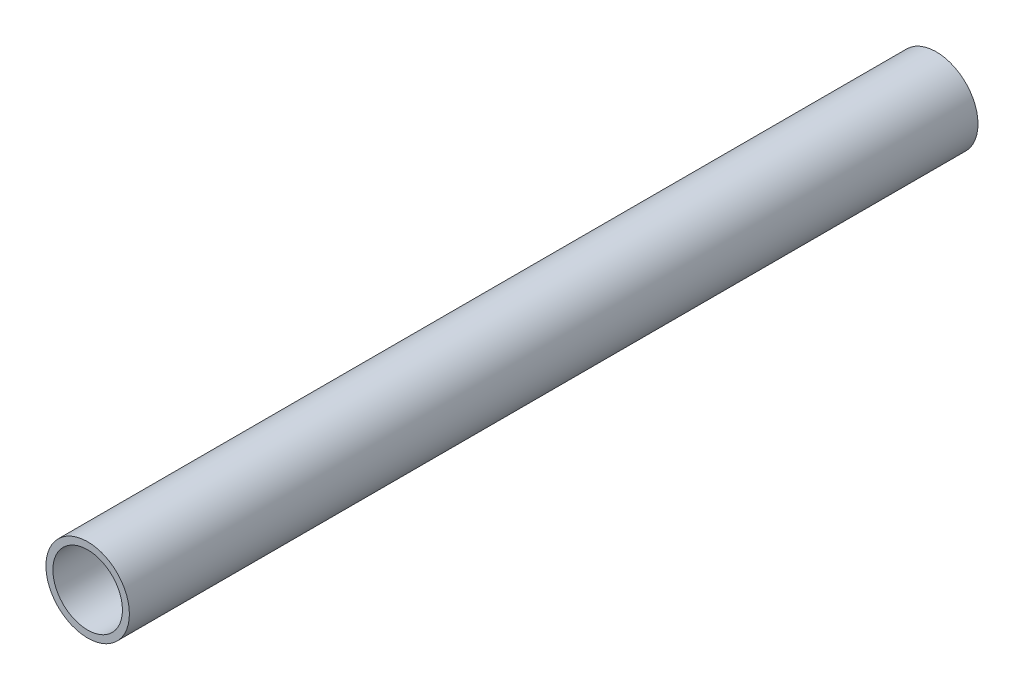
ISO-10303-21;
HEADER;
FILE_DESCRIPTION(('STEP AP214'),'2;1');
FILE_NAME('part.step','',(''),(''),'','','');
FILE_SCHEMA(('AUTOMOTIVE_DESIGN { 1 0 10303 214 1 1 1 1 }'));
ENDSEC;
DATA;
#1=APPLICATION_CONTEXT('core data for automotive mechanical design processes');
#2=APPLICATION_PROTOCOL_DEFINITION('international standard','automotive_design',2000,#1);
#3=PRODUCT_CONTEXT('',#1,'mechanical');
#4=PRODUCT('Part','Part','',(#3));
#5=PRODUCT_RELATED_PRODUCT_CATEGORY('part','',(#4));
#6=PRODUCT_DEFINITION_FORMATION('','',#4);
#7=PRODUCT_DEFINITION_CONTEXT('part definition',#1,'design');
#8=PRODUCT_DEFINITION('design','',#6,#7);
#9=PRODUCT_DEFINITION_SHAPE('','',#8);
#10=(LENGTH_UNIT() NAMED_UNIT(*) SI_UNIT(.MILLI.,.METRE.));
#11=(NAMED_UNIT(*) PLANE_ANGLE_UNIT() SI_UNIT($,.RADIAN.));
#12=(NAMED_UNIT(*) SI_UNIT($,.STERADIAN.) SOLID_ANGLE_UNIT());
#13=UNCERTAINTY_MEASURE_WITH_UNIT(LENGTH_MEASURE(1.E-05),#10,'distance_accuracy_value','');
#14=(GEOMETRIC_REPRESENTATION_CONTEXT(3) GLOBAL_UNCERTAINTY_ASSIGNED_CONTEXT((#13)) GLOBAL_UNIT_ASSIGNED_CONTEXT((#10,
#11,#12)) REPRESENTATION_CONTEXT('',''));
#15=CARTESIAN_POINT('',(0.,0.,0.));
#16=DIRECTION('',(0.,0.,1.));
#17=DIRECTION('',(1.,0.,0.));
#18=AXIS2_PLACEMENT_3D('',#15,#16,#17);
#19=CARTESIAN_POINT('',(0.,0.,-610.));
#20=DIRECTION('',(0.,0.,1.));
#21=DIRECTION('',(1.,0.,0.));
#22=AXIS2_PLACEMENT_3D('',#19,#20,#21);
#23=CYLINDRICAL_SURFACE('',#22,30.);
#24=CARTESIAN_POINT('',(0.,0.,-610.));
#25=DIRECTION('',(0.,0.,1.));
#26=DIRECTION('',(1.,0.,0.));
#27=AXIS2_PLACEMENT_3D('',#24,#25,#26);
#28=CIRCLE('',#27,30.);
#29=CARTESIAN_POINT('',(30.,0.,-610.));
#30=VERTEX_POINT('',#29);
#31=EDGE_CURVE('E10',#30,#30,#28,.T.);
#32=ORIENTED_EDGE('',*,*,#31,.T.);
#33=EDGE_LOOP('',(#32));
#34=FACE_BOUND('',#33,.T.);
#35=CARTESIAN_POINT('',(0.,0.,0.));
#36=DIRECTION('',(0.,0.,1.));
#37=DIRECTION('',(1.,0.,0.));
#38=AXIS2_PLACEMENT_3D('',#35,#36,#37);
#39=CIRCLE('',#38,30.);
#40=CARTESIAN_POINT('',(30.,0.,0.));
#41=VERTEX_POINT('',#40);
#42=EDGE_CURVE('E40',#41,#41,#39,.T.);
#43=ORIENTED_EDGE('',*,*,#42,.F.);
#44=EDGE_LOOP('',(#43));
#45=FACE_BOUND('',#44,.T.);
#46=ADVANCED_FACE('F37',(#34,#45),#23,.T.);
#47=CARTESIAN_POINT('',(0.,0.,-610.));
#48=DIRECTION('',(0.,0.,1.));
#49=DIRECTION('',(1.,0.,0.));
#50=AXIS2_PLACEMENT_3D('',#47,#48,#49);
#51=PLANE('',#50);
#52=CARTESIAN_POINT('',(0.,0.,-610.));
#53=DIRECTION('',(0.,0.,1.));
#54=DIRECTION('',(1.,0.,0.));
#55=AXIS2_PLACEMENT_3D('',#52,#53,#54);
#56=CIRCLE('',#55,25.);
#57=CARTESIAN_POINT('',(25.,0.,-610.));
#58=VERTEX_POINT('',#57);
#59=EDGE_CURVE('E49',#58,#58,#56,.T.);
#60=ORIENTED_EDGE('',*,*,#59,.T.);
#61=EDGE_LOOP('',(#60));
#62=FACE_BOUND('',#61,.T.);
#63=ORIENTED_EDGE('',*,*,#31,.F.);
#64=EDGE_LOOP('',(#63));
#65=FACE_BOUND('',#64,.T.);
#66=ADVANCED_FACE('F59',(#62,#65),#51,.F.);
#67=CARTESIAN_POINT('',(0.,0.,0.));
#68=DIRECTION('',(0.,0.,1.));
#69=DIRECTION('',(1.,0.,0.));
#70=AXIS2_PLACEMENT_3D('',#67,#68,#69);
#71=PLANE('',#70);
#72=CARTESIAN_POINT('',(0.,0.,0.));
#73=DIRECTION('',(0.,0.,1.));
#74=DIRECTION('',(1.,0.,0.));
#75=AXIS2_PLACEMENT_3D('',#72,#73,#74);
#76=CIRCLE('',#75,25.);
#77=CARTESIAN_POINT('',(25.,0.,0.));
#78=VERTEX_POINT('',#77);
#79=EDGE_CURVE('E51',#78,#78,#76,.T.);
#80=ORIENTED_EDGE('',*,*,#79,.F.);
#81=EDGE_LOOP('',(#80));
#82=FACE_BOUND('',#81,.T.);
#83=ORIENTED_EDGE('',*,*,#42,.T.);
#84=EDGE_LOOP('',(#83));
#85=FACE_BOUND('',#84,.T.);
#86=ADVANCED_FACE('F65',(#82,#85),#71,.T.);
#87=CARTESIAN_POINT('',(0.,0.,-610.));
#88=DIRECTION('',(0.,0.,1.));
#89=DIRECTION('',(1.,0.,0.));
#90=AXIS2_PLACEMENT_3D('',#87,#88,#89);
#91=CYLINDRICAL_SURFACE('',#90,25.);
#92=ORIENTED_EDGE('',*,*,#59,.F.);
#93=EDGE_LOOP('',(#92));
#94=FACE_BOUND('',#93,.T.);
#95=ORIENTED_EDGE('',*,*,#79,.T.);
#96=EDGE_LOOP('',(#95));
#97=FACE_BOUND('',#96,.T.);
#98=ADVANCED_FACE('F62',(#94,#97),#91,.F.);
#99=CLOSED_SHELL('',(#46,#66,#86,#98));
#100=MANIFOLD_SOLID_BREP('B2',#99);
#101=ADVANCED_BREP_SHAPE_REPRESENTATION('',(#18,#100),#14);
#102=SHAPE_DEFINITION_REPRESENTATION(#9,#101);
ENDSEC;
END-ISO-10303-21;
